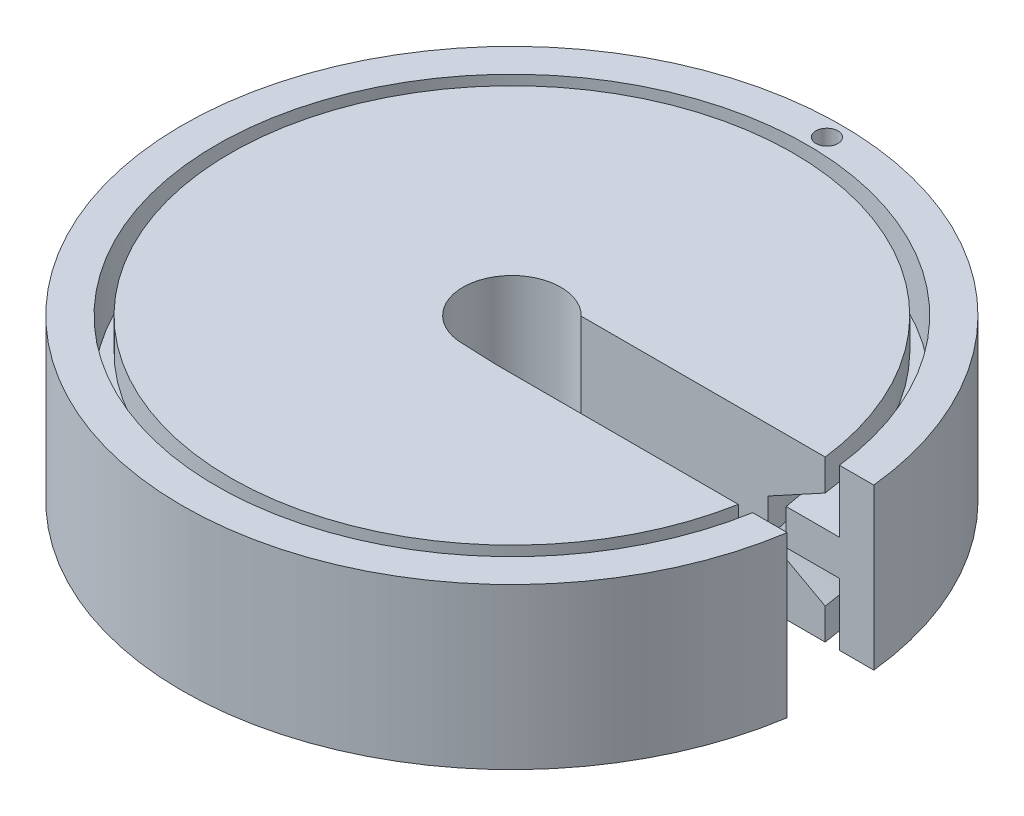
ISO-10303-21;
HEADER;
FILE_DESCRIPTION(('STEP AP214'),'2;1');
FILE_NAME('part.step','',(''),(''),'','','');
FILE_SCHEMA(('AUTOMOTIVE_DESIGN { 1 0 10303 214 1 1 1 1 }'));
ENDSEC;
DATA;
#1=APPLICATION_CONTEXT('core data for automotive mechanical design processes');
#2=APPLICATION_PROTOCOL_DEFINITION('international standard','automotive_design',2000,#1);
#3=PRODUCT_CONTEXT('',#1,'mechanical');
#4=PRODUCT('Part','Part','',(#3));
#5=PRODUCT_RELATED_PRODUCT_CATEGORY('part','',(#4));
#6=PRODUCT_DEFINITION_FORMATION('','',#4);
#7=PRODUCT_DEFINITION_CONTEXT('part definition',#1,'design');
#8=PRODUCT_DEFINITION('design','',#6,#7);
#9=PRODUCT_DEFINITION_SHAPE('','',#8);
#10=(LENGTH_UNIT() NAMED_UNIT(*) SI_UNIT(.MILLI.,.METRE.));
#11=(NAMED_UNIT(*) PLANE_ANGLE_UNIT() SI_UNIT($,.RADIAN.));
#12=(NAMED_UNIT(*) SI_UNIT($,.STERADIAN.) SOLID_ANGLE_UNIT());
#13=UNCERTAINTY_MEASURE_WITH_UNIT(LENGTH_MEASURE(1.E-05),#10,'distance_accuracy_value','');
#14=(GEOMETRIC_REPRESENTATION_CONTEXT(3) GLOBAL_UNCERTAINTY_ASSIGNED_CONTEXT((#13)) GLOBAL_UNIT_ASSIGNED_CONTEXT((#10,
#11,#12)) REPRESENTATION_CONTEXT('',''));
#15=CARTESIAN_POINT('',(0.,0.,0.));
#16=DIRECTION('',(0.,0.,1.));
#17=DIRECTION('',(1.,0.,0.));
#18=AXIS2_PLACEMENT_3D('',#15,#16,#17);
#19=CARTESIAN_POINT('',(0.,0.,0.));
#20=DIRECTION('',(0.,1.,0.));
#21=DIRECTION('',(0.,0.,1.));
#22=AXIS2_PLACEMENT_3D('',#19,#20,#21);
#23=CYLINDRICAL_SURFACE('',#22,6.635);
#24=CARTESIAN_POINT('',(0.,0.,0.));
#25=DIRECTION('',(0.,1.,0.));
#26=DIRECTION('',(0.,0.,1.));
#27=AXIS2_PLACEMENT_3D('',#24,#25,#26);
#28=CIRCLE('',#27,6.635);
#29=CARTESIAN_POINT('',(6.59076876108202,0.,-0.764847787435785));
#30=VERTEX_POINT('',#29);
#31=CARTESIAN_POINT('',(6.53779356702054,0.,1.13158308357133));
#32=VERTEX_POINT('',#31);
#33=EDGE_CURVE('E151',#30,#32,#28,.T.);
#34=ORIENTED_EDGE('',*,*,#33,.F.);
#35=DIRECTION('',(0.,1.,0.));
#36=VECTOR('',#35,1.);
#37=CARTESIAN_POINT('',(6.59076876108202,0.,-0.764847787435785));
#38=LINE('',#37,#36);
#39=CARTESIAN_POINT('',(6.59076876108202,1.4,-0.764847787435785));
#40=VERTEX_POINT('',#39);
#41=EDGE_CURVE('E177',#30,#40,#38,.T.);
#42=ORIENTED_EDGE('',*,*,#41,.T.);
#43=CARTESIAN_POINT('',(0.,1.4,0.));
#44=DIRECTION('',(0.,1.,0.));
#45=DIRECTION('',(0.,0.,1.));
#46=AXIS2_PLACEMENT_3D('',#43,#44,#45);
#47=CIRCLE('',#46,6.635);
#48=CARTESIAN_POINT('',(6.53779356702054,1.4,1.13158308357133));
#49=VERTEX_POINT('',#48);
#50=EDGE_CURVE('E163',#49,#40,#47,.F.);
#51=ORIENTED_EDGE('',*,*,#50,.F.);
#52=DIRECTION('',(0.,1.,0.));
#53=VECTOR('',#52,1.);
#54=CARTESIAN_POINT('',(6.53779356702054,0.,1.13158308357133));
#55=LINE('',#54,#53);
#56=EDGE_CURVE('E135',#49,#32,#55,.F.);
#57=ORIENTED_EDGE('',*,*,#56,.T.);
#58=EDGE_LOOP('',(#34,#42,#51,#57));
#59=FACE_BOUND('',#58,.T.);
#60=ADVANCED_FACE('F61',(#59),#23,.F.);
#61=CARTESIAN_POINT('',(0.,3.6,0.));
#62=DIRECTION('',(0.,1.,0.));
#63=DIRECTION('',(0.,0.,1.));
#64=AXIS2_PLACEMENT_3D('',#61,#62,#63);
#65=PLANE('',#64);
#66=CARTESIAN_POINT('',(0.0701378967160222,3.6,-7.00412409738008));
#67=DIRECTION('',(0.,1.,0.));
#68=DIRECTION('',(0.,0.,1.));
#69=AXIS2_PLACEMENT_3D('',#66,#67,#68);
#70=CIRCLE('',#69,0.247262234227057);
#71=CARTESIAN_POINT('',(0.0701378967160222,3.6,-6.75686186315302));
#72=VERTEX_POINT('',#71);
#73=EDGE_CURVE('E146',#72,#72,#70,.T.);
#74=ORIENTED_EDGE('',*,*,#73,.F.);
#75=EDGE_LOOP('',(#74));
#76=FACE_BOUND('',#75,.T.);
#77=DIRECTION('',(-1.,0.,0.));
#78=VECTOR('',#77,1.);
#79=CARTESIAN_POINT('',(0.748503344471411,3.6,-0.764847787435785));
#80=LINE('',#79,#78);
#81=CARTESIAN_POINT('',(7.36187744560648,3.6,-0.764847787435785));
#82=VERTEX_POINT('',#81);
#83=CARTESIAN_POINT('',(6.59076876108202,3.6,-0.764847787435785));
#84=VERTEX_POINT('',#83);
#85=EDGE_CURVE('E145',#82,#84,#80,.T.);
#86=ORIENTED_EDGE('',*,*,#85,.F.);
#87=CARTESIAN_POINT('',(0.,3.6,0.));
#88=DIRECTION('',(0.,1.,0.));
#89=DIRECTION('',(0.,0.,1.));
#90=AXIS2_PLACEMENT_3D('',#87,#88,#89);
#91=CIRCLE('',#90,7.40150198689934);
#92=CARTESIAN_POINT('',(7.31448914053812,3.6,1.13158308357133));
#93=VERTEX_POINT('',#92);
#94=EDGE_CURVE('E144',#82,#93,#91,.T.);
#95=ORIENTED_EDGE('',*,*,#94,.T.);
#96=DIRECTION('',(1.,0.,0.));
#97=VECTOR('',#96,1.);
#98=CARTESIAN_POINT('',(8.00599840851785,3.6,1.13158308357133));
#99=LINE('',#98,#97);
#100=CARTESIAN_POINT('',(6.53779356702054,3.6,1.13158308357133));
#101=VERTEX_POINT('',#100);
#102=EDGE_CURVE('E127',#101,#93,#99,.T.);
#103=ORIENTED_EDGE('',*,*,#102,.F.);
#104=CARTESIAN_POINT('',(0.,3.6,0.));
#105=DIRECTION('',(0.,1.,0.));
#106=DIRECTION('',(0.,0.,1.));
#107=AXIS2_PLACEMENT_3D('',#104,#105,#106);
#108=CIRCLE('',#107,6.635);
#109=EDGE_CURVE('E142',#84,#101,#108,.T.);
#110=ORIENTED_EDGE('',*,*,#109,.F.);
#111=EDGE_LOOP('',(#86,#95,#103,#110));
#112=FACE_BOUND('',#111,.T.);
#113=ADVANCED_FACE('F141',(#76,#112),#65,.T.);
#114=CARTESIAN_POINT('',(0.,2.2,0.));
#115=DIRECTION('',(0.,1.,0.));
#116=DIRECTION('',(0.,0.,1.));
#117=AXIS2_PLACEMENT_3D('',#114,#115,#116);
#118=CIRCLE('',#117,6.635);
#119=CARTESIAN_POINT('',(6.53779356702054,2.2,1.13158308357133));
#120=VERTEX_POINT('',#119);
#121=CARTESIAN_POINT('',(6.59076876108202,2.2,-0.764847787435785));
#122=VERTEX_POINT('',#121);
#123=EDGE_CURVE('E152',#120,#122,#118,.F.);
#124=ORIENTED_EDGE('',*,*,#123,.T.);
#125=DIRECTION('',(0.,1.,0.));
#126=VECTOR('',#125,1.);
#127=CARTESIAN_POINT('',(6.59076876108202,0.,-0.764847787435785));
#128=LINE('',#127,#126);
#129=EDGE_CURVE('E150',#122,#84,#128,.T.);
#130=ORIENTED_EDGE('',*,*,#129,.T.);
#131=ORIENTED_EDGE('',*,*,#109,.T.);
#132=DIRECTION('',(0.,1.,0.));
#133=VECTOR('',#132,1.);
#134=CARTESIAN_POINT('',(6.53779356702054,0.,1.13158308357133));
#135=LINE('',#134,#133);
#136=EDGE_CURVE('E124',#101,#120,#135,.F.);
#137=ORIENTED_EDGE('',*,*,#136,.T.);
#138=EDGE_LOOP('',(#124,#130,#131,#137));
#139=FACE_BOUND('',#138,.T.);
#140=ADVANCED_FACE('F149',(#139),#23,.F.);
#141=CARTESIAN_POINT('',(0.,0.7,0.));
#142=DIRECTION('',(0.,-1.,0.));
#143=DIRECTION('',(0.,0.,-1.));
#144=AXIS2_PLACEMENT_3D('',#141,#142,#143);
#145=CYLINDRICAL_SURFACE('',#144,7.40150198689934);
#146=DIRECTION('',(0.,-1.,0.));
#147=VECTOR('',#146,1.);
#148=CARTESIAN_POINT('',(7.36187744560648,0.7,-0.764847787435785));
#149=LINE('',#148,#147);
#150=CARTESIAN_POINT('',(7.36187744560648,0.,-0.764847787435785));
#151=VERTEX_POINT('',#150);
#152=EDGE_CURVE('E173',#151,#82,#149,.F.);
#153=ORIENTED_EDGE('',*,*,#152,.F.);
#154=CARTESIAN_POINT('',(0.,0.,0.));
#155=DIRECTION('',(0.,-1.,0.));
#156=DIRECTION('',(0.,0.,-1.));
#157=AXIS2_PLACEMENT_3D('',#154,#155,#156);
#158=CIRCLE('',#157,7.40150198689934);
#159=CARTESIAN_POINT('',(7.31448914053812,0.,1.13158308357133));
#160=VERTEX_POINT('',#159);
#161=EDGE_CURVE('E160',#160,#151,#158,.T.);
#162=ORIENTED_EDGE('',*,*,#161,.F.);
#163=DIRECTION('',(0.,-1.,0.));
#164=VECTOR('',#163,1.);
#165=CARTESIAN_POINT('',(7.31448914053812,0.7,1.13158308357133));
#166=LINE('',#165,#164);
#167=EDGE_CURVE('E184',#93,#160,#166,.T.);
#168=ORIENTED_EDGE('',*,*,#167,.F.);
#169=ORIENTED_EDGE('',*,*,#94,.F.);
#170=EDGE_LOOP('',(#153,#162,#168,#169));
#171=FACE_BOUND('',#170,.T.);
#172=ADVANCED_FACE('F63',(#171),#145,.T.);
#173=CARTESIAN_POINT('',(0.,0.,0.));
#174=DIRECTION('',(0.,-1.,0.));
#175=DIRECTION('',(0.,0.,-1.));
#176=AXIS2_PLACEMENT_3D('',#173,#174,#175);
#177=PLANE('',#176);
#178=CARTESIAN_POINT('',(0.0701378967160222,0.,-7.00412409738008));
#179=DIRECTION('',(0.,-1.,0.));
#180=DIRECTION('',(0.,0.,-1.));
#181=AXIS2_PLACEMENT_3D('',#178,#179,#180);
#182=CIRCLE('',#181,0.247262234227057);
#183=CARTESIAN_POINT('',(0.0701378967160222,0.,-7.25138633160714));
#184=VERTEX_POINT('',#183);
#185=EDGE_CURVE('E65',#184,#184,#182,.T.);
#186=ORIENTED_EDGE('',*,*,#185,.F.);
#187=EDGE_LOOP('',(#186));
#188=FACE_BOUND('',#187,.T.);
#189=DIRECTION('',(-1.,0.,0.));
#190=VECTOR('',#189,1.);
#191=CARTESIAN_POINT('',(0.748503344471411,0.,-0.764847787435785));
#192=LINE('',#191,#190);
#193=EDGE_CURVE('E190',#151,#30,#192,.T.);
#194=ORIENTED_EDGE('',*,*,#193,.T.);
#195=ORIENTED_EDGE('',*,*,#33,.T.);
#196=DIRECTION('',(1.,0.,0.));
#197=VECTOR('',#196,1.);
#198=CARTESIAN_POINT('',(8.00599840851785,0.,1.13158308357133));
#199=LINE('',#198,#197);
#200=EDGE_CURVE('E191',#32,#160,#199,.T.);
#201=ORIENTED_EDGE('',*,*,#200,.T.);
#202=ORIENTED_EDGE('',*,*,#161,.T.);
#203=EDGE_LOOP('',(#194,#195,#201,#202));
#204=FACE_BOUND('',#203,.T.);
#205=ADVANCED_FACE('F205',(#188,#204),#177,.T.);
#206=CARTESIAN_POINT('',(0.,2.2,0.));
#207=DIRECTION('',(0.,1.,0.));
#208=DIRECTION('',(0.,0.,1.));
#209=AXIS2_PLACEMENT_3D('',#206,#207,#208);
#210=PLANE('',#209);
#211=DIRECTION('',(-1.,0.,0.));
#212=VECTOR('',#211,1.);
#213=CARTESIAN_POINT('',(0.,2.2,-0.764847787435785));
#214=LINE('',#213,#212);
#215=CARTESIAN_POINT('',(5.39606410840852,2.2,-0.764847787435785));
#216=VERTEX_POINT('',#215);
#217=EDGE_CURVE('E84',#122,#216,#214,.T.);
#218=ORIENTED_EDGE('',*,*,#217,.F.);
#219=ORIENTED_EDGE('',*,*,#123,.F.);
#220=DIRECTION('',(1.,0.,0.));
#221=VECTOR('',#220,1.);
#222=CARTESIAN_POINT('',(0.,2.2,1.13158308357133));
#223=LINE('',#222,#221);
#224=CARTESIAN_POINT('',(5.33123060136918,2.2,1.13158308357133));
#225=VERTEX_POINT('',#224);
#226=EDGE_CURVE('E130',#225,#120,#223,.T.);
#227=ORIENTED_EDGE('',*,*,#226,.F.);
#228=CARTESIAN_POINT('',(0.,2.2,0.));
#229=DIRECTION('',(0.,1.,0.));
#230=DIRECTION('',(0.,0.,1.));
#231=AXIS2_PLACEMENT_3D('',#228,#229,#230);
#232=CIRCLE('',#231,5.45);
#233=EDGE_CURVE('E156',#216,#225,#232,.T.);
#234=ORIENTED_EDGE('',*,*,#233,.F.);
#235=EDGE_LOOP('',(#218,#219,#227,#234));
#236=FACE_BOUND('',#235,.T.);
#237=ADVANCED_FACE('F208',(#236),#210,.T.);
#238=CARTESIAN_POINT('',(0.,1.4,0.));
#239=DIRECTION('',(0.,1.,0.));
#240=DIRECTION('',(0.,0.,1.));
#241=AXIS2_PLACEMENT_3D('',#238,#239,#240);
#242=PLANE('',#241);
#243=ORIENTED_EDGE('',*,*,#50,.T.);
#244=DIRECTION('',(-1.,0.,0.));
#245=VECTOR('',#244,1.);
#246=CARTESIAN_POINT('',(0.,1.4,-0.764847787435785));
#247=LINE('',#246,#245);
#248=CARTESIAN_POINT('',(5.39606410840852,1.4,-0.764847787435785));
#249=VERTEX_POINT('',#248);
#250=EDGE_CURVE('E182',#40,#249,#247,.T.);
#251=ORIENTED_EDGE('',*,*,#250,.T.);
#252=CARTESIAN_POINT('',(0.,1.4,0.));
#253=DIRECTION('',(0.,1.,0.));
#254=DIRECTION('',(0.,0.,1.));
#255=AXIS2_PLACEMENT_3D('',#252,#253,#254);
#256=CIRCLE('',#255,5.45);
#257=CARTESIAN_POINT('',(5.33123060136918,1.4,1.13158308357133));
#258=VERTEX_POINT('',#257);
#259=EDGE_CURVE('E170',#249,#258,#256,.T.);
#260=ORIENTED_EDGE('',*,*,#259,.T.);
#261=DIRECTION('',(1.,0.,0.));
#262=VECTOR('',#261,1.);
#263=CARTESIAN_POINT('',(0.,1.4,1.13158308357133));
#264=LINE('',#263,#262);
#265=EDGE_CURVE('E77',#258,#49,#264,.T.);
#266=ORIENTED_EDGE('',*,*,#265,.T.);
#267=EDGE_LOOP('',(#243,#251,#260,#266));
#268=FACE_BOUND('',#267,.T.);
#269=ADVANCED_FACE('F213',(#268),#242,.F.);
#270=CARTESIAN_POINT('',(0.,2.2,0.));
#271=DIRECTION('',(0.,-1.,0.));
#272=DIRECTION('',(0.,0.,-1.));
#273=AXIS2_PLACEMENT_3D('',#270,#271,#272);
#274=CYLINDRICAL_SURFACE('',#273,5.45);
#275=DIRECTION('',(0.,-1.,0.));
#276=VECTOR('',#275,1.);
#277=CARTESIAN_POINT('',(5.39606410840852,2.2,-0.764847787435785));
#278=LINE('',#277,#276);
#279=EDGE_CURVE('E13',#216,#249,#278,.T.);
#280=ORIENTED_EDGE('',*,*,#279,.F.);
#281=ORIENTED_EDGE('',*,*,#233,.T.);
#282=DIRECTION('',(0.,-1.,0.));
#283=VECTOR('',#282,1.);
#284=CARTESIAN_POINT('',(5.33123060136918,2.2,1.13158308357133));
#285=LINE('',#284,#283);
#286=EDGE_CURVE('E70',#258,#225,#285,.F.);
#287=ORIENTED_EDGE('',*,*,#286,.F.);
#288=ORIENTED_EDGE('',*,*,#259,.F.);
#289=EDGE_LOOP('',(#280,#281,#287,#288));
#290=FACE_BOUND('',#289,.T.);
#291=ADVANCED_FACE('F216',(#290),#274,.F.);
#292=CARTESIAN_POINT('',(8.00599840851785,0.,1.13158308357133));
#293=DIRECTION('',(0.,0.,1.));
#294=DIRECTION('',(1.,0.,0.));
#295=AXIS2_PLACEMENT_3D('',#292,#293,#294);
#296=PLANE('',#295);
#297=ORIENTED_EDGE('',*,*,#167,.T.);
#298=ORIENTED_EDGE('',*,*,#200,.F.);
#299=ORIENTED_EDGE('',*,*,#56,.F.);
#300=ORIENTED_EDGE('',*,*,#265,.F.);
#301=ORIENTED_EDGE('',*,*,#286,.T.);
#302=ORIENTED_EDGE('',*,*,#226,.T.);
#303=ORIENTED_EDGE('',*,*,#136,.F.);
#304=ORIENTED_EDGE('',*,*,#102,.T.);
#305=EDGE_LOOP('',(#297,#298,#299,#300,#301,#302,#303,#304));
#306=FACE_BOUND('',#305,.T.);
#307=ADVANCED_FACE('F126',(#306),#296,.F.);
#308=CARTESIAN_POINT('',(0.748503344471411,0.,-0.764847787435785));
#309=DIRECTION('',(0.,0.,-1.));
#310=DIRECTION('',(-1.,0.,0.));
#311=AXIS2_PLACEMENT_3D('',#308,#309,#310);
#312=PLANE('',#311);
#313=ORIENTED_EDGE('',*,*,#152,.T.);
#314=ORIENTED_EDGE('',*,*,#85,.T.);
#315=ORIENTED_EDGE('',*,*,#129,.F.);
#316=ORIENTED_EDGE('',*,*,#217,.T.);
#317=ORIENTED_EDGE('',*,*,#279,.T.);
#318=ORIENTED_EDGE('',*,*,#250,.F.);
#319=ORIENTED_EDGE('',*,*,#41,.F.);
#320=ORIENTED_EDGE('',*,*,#193,.F.);
#321=EDGE_LOOP('',(#313,#314,#315,#316,#317,#318,#319,#320));
#322=FACE_BOUND('',#321,.T.);
#323=ADVANCED_FACE('F240',(#322),#312,.F.);
#324=CARTESIAN_POINT('',(0.0701378967160222,-1.4,-7.00412409738008));
#325=DIRECTION('',(0.,1.,0.));
#326=DIRECTION('',(0.,0.,1.));
#327=AXIS2_PLACEMENT_3D('',#324,#325,#326);
#328=CYLINDRICAL_SURFACE('',#327,0.247262234227057);
#329=ORIENTED_EDGE('',*,*,#73,.T.);
#330=EDGE_LOOP('',(#329));
#331=FACE_BOUND('',#330,.T.);
#332=ORIENTED_EDGE('',*,*,#185,.T.);
#333=EDGE_LOOP('',(#332));
#334=FACE_BOUND('',#333,.T.);
#335=ADVANCED_FACE('F203',(#331,#334),#328,.F.);
#336=CLOSED_SHELL('',(#60,#113,#140,#172,#205,#237,#269,#291,#307,#323,#335));
#337=MANIFOLD_SOLID_BREP('B2',#336);
#338=CARTESIAN_POINT('',(0.,0.7,0.));
#339=DIRECTION('',(0.,1.,0.));
#340=DIRECTION('',(0.,0.,1.));
#341=AXIS2_PLACEMENT_3D('',#338,#339,#340);
#342=PLANE('',#341);
#343=DIRECTION('',(-0.999110978780776,0.,-0.0421574676625482));
#344=VECTOR('',#343,1.);
#345=CARTESIAN_POINT('',(-0.0463319876571722,0.7,1.09804502271231));
#346=LINE('',#345,#344);
#347=CARTESIAN_POINT('',(0.748503344471411,0.7,1.13158308357133));
#348=VERTEX_POINT('',#347);
#349=CARTESIAN_POINT('',(0.,0.7,1.1));
#350=VERTEX_POINT('',#349);
#351=EDGE_CURVE('E452',#348,#350,#346,.T.);
#352=ORIENTED_EDGE('',*,*,#351,.F.);
#353=DIRECTION('',(1.,0.,0.));
#354=VECTOR('',#353,1.);
#355=CARTESIAN_POINT('',(0.,0.7,1.13158308357133));
#356=LINE('',#355,#354);
#357=CARTESIAN_POINT('',(1.94474155737342,0.7,1.13158308357133));
#358=VERTEX_POINT('',#357);
#359=EDGE_CURVE('E463',#348,#358,#356,.T.);
#360=ORIENTED_EDGE('',*,*,#359,.T.);
#361=CARTESIAN_POINT('',(0.,0.7,0.));
#362=DIRECTION('',(0.,1.,0.));
#363=DIRECTION('',(0.,0.,1.));
#364=AXIS2_PLACEMENT_3D('',#361,#362,#363);
#365=CIRCLE('',#364,2.25);
#366=CARTESIAN_POINT('',(2.11601225470331,0.7,-0.764847787435785));
#367=VERTEX_POINT('',#366);
#368=EDGE_CURVE('E629',#367,#358,#365,.T.);
#369=ORIENTED_EDGE('',*,*,#368,.F.);
#370=DIRECTION('',(-1.,0.,0.));
#371=VECTOR('',#370,1.);
#372=CARTESIAN_POINT('',(0.,0.7,-0.764847787435785));
#373=LINE('',#372,#371);
#374=CARTESIAN_POINT('',(0.790574387426373,0.7,-0.764847787435785));
#375=VERTEX_POINT('',#374);
#376=EDGE_CURVE('E457',#367,#375,#373,.T.);
#377=ORIENTED_EDGE('',*,*,#376,.T.);
#378=CARTESIAN_POINT('',(0.,0.7,0.));
#379=DIRECTION('',(0.,-1.,0.));
#380=DIRECTION('',(0.,0.,-1.));
#381=AXIS2_PLACEMENT_3D('',#378,#379,#380);
#382=CIRCLE('',#381,1.1);
#383=EDGE_CURVE('E466',#350,#375,#382,.T.);
#384=ORIENTED_EDGE('',*,*,#383,.F.);
#385=EDGE_LOOP('',(#352,#360,#369,#377,#384));
#386=FACE_BOUND('',#385,.T.);
#387=ADVANCED_FACE('F359',(#386),#342,.F.);
#388=CARTESIAN_POINT('',(0.,3.6,0.));
#389=DIRECTION('',(0.,1.,0.));
#390=DIRECTION('',(0.,0.,1.));
#391=AXIS2_PLACEMENT_3D('',#388,#389,#390);
#392=PLANE('',#391);
#393=DIRECTION('',(1.,0.,0.));
#394=VECTOR('',#393,1.);
#395=CARTESIAN_POINT('',(8.00599840851785,3.6,1.13158308357133));
#396=LINE('',#395,#394);
#397=CARTESIAN_POINT('',(0.748503344471411,3.6,1.13158308357133));
#398=VERTEX_POINT('',#397);
#399=CARTESIAN_POINT('',(6.21602471860115,3.6,1.13158308357133));
#400=VERTEX_POINT('',#399);
#401=EDGE_CURVE('E468',#398,#400,#396,.T.);
#402=ORIENTED_EDGE('',*,*,#401,.F.);
#403=DIRECTION('',(-0.999110978780776,0.,-0.0421574676625482));
#404=VECTOR('',#403,1.);
#405=CARTESIAN_POINT('',(-0.0463319876571722,3.6,1.09804502271231));
#406=LINE('',#405,#404);
#407=CARTESIAN_POINT('',(0.,3.6,1.1));
#408=VERTEX_POINT('',#407);
#409=EDGE_CURVE('E454',#398,#408,#406,.T.);
#410=ORIENTED_EDGE('',*,*,#409,.T.);
#411=CARTESIAN_POINT('',(0.,3.6,0.));
#412=DIRECTION('',(0.,-1.,0.));
#413=DIRECTION('',(0.,0.,-1.));
#414=AXIS2_PLACEMENT_3D('',#411,#412,#413);
#415=CIRCLE('',#414,1.1);
#416=CARTESIAN_POINT('',(0.790574387426373,3.6,-0.764847787435785));
#417=VERTEX_POINT('',#416);
#418=EDGE_CURVE('E379',#408,#417,#415,.T.);
#419=ORIENTED_EDGE('',*,*,#418,.T.);
#420=DIRECTION('',(-1.,0.,0.));
#421=VECTOR('',#420,1.);
#422=CARTESIAN_POINT('',(0.748503344471411,3.6,-0.764847787435785));
#423=LINE('',#422,#421);
#424=CARTESIAN_POINT('',(6.27171838010444,3.6,-0.764847787435785));
#425=VERTEX_POINT('',#424);
#426=EDGE_CURVE('E644',#425,#417,#423,.T.);
#427=ORIENTED_EDGE('',*,*,#426,.F.);
#428=CARTESIAN_POINT('',(0.,3.6,0.));
#429=DIRECTION('',(0.,1.,0.));
#430=DIRECTION('',(0.,0.,1.));
#431=AXIS2_PLACEMENT_3D('',#428,#429,#430);
#432=CIRCLE('',#431,6.3181835662859);
#433=EDGE_CURVE('E485',#425,#400,#432,.T.);
#434=ORIENTED_EDGE('',*,*,#433,.T.);
#435=EDGE_LOOP('',(#402,#410,#419,#427,#434));
#436=FACE_BOUND('',#435,.T.);
#437=ADVANCED_FACE('F694',(#436),#392,.T.);
#438=CARTESIAN_POINT('',(0.,3.6,0.));
#439=DIRECTION('',(0.,-1.,0.));
#440=DIRECTION('',(0.,0.,-1.));
#441=AXIS2_PLACEMENT_3D('',#438,#439,#440);
#442=CYLINDRICAL_SURFACE('',#441,1.1);
#443=DIRECTION('',(0.,-1.,0.));
#444=VECTOR('',#443,1.);
#445=CARTESIAN_POINT('',(0.,6.4,1.1));
#446=LINE('',#445,#444);
#447=EDGE_CURVE('E698',#408,#350,#446,.T.);
#448=ORIENTED_EDGE('',*,*,#447,.T.);
#449=ORIENTED_EDGE('',*,*,#383,.T.);
#450=DIRECTION('',(0.,-1.,0.));
#451=VECTOR('',#450,1.);
#452=CARTESIAN_POINT('',(0.790574387426373,3.6,-0.764847787435785));
#453=LINE('',#452,#451);
#454=EDGE_CURVE('E59',#375,#417,#453,.F.);
#455=ORIENTED_EDGE('',*,*,#454,.T.);
#456=ORIENTED_EDGE('',*,*,#418,.F.);
#457=EDGE_LOOP('',(#448,#449,#455,#456));
#458=FACE_BOUND('',#457,.T.);
#459=ADVANCED_FACE('F697',(#458),#442,.F.);
#460=CARTESIAN_POINT('',(0.,0.,0.));
#461=DIRECTION('',(0.,1.,0.));
#462=DIRECTION('',(0.,0.,1.));
#463=AXIS2_PLACEMENT_3D('',#460,#461,#462);
#464=PLANE('',#463);
#465=CARTESIAN_POINT('',(0.,0.,0.));
#466=DIRECTION('',(0.,1.,0.));
#467=DIRECTION('',(0.,0.,1.));
#468=AXIS2_PLACEMENT_3D('',#465,#466,#467);
#469=CIRCLE('',#468,6.3181835662859);
#470=CARTESIAN_POINT('',(6.27171838010444,0.,-0.764847787435785));
#471=VERTEX_POINT('',#470);
#472=CARTESIAN_POINT('',(6.21602471860115,0.,1.13158308357133));
#473=VERTEX_POINT('',#472);
#474=EDGE_CURVE('E593',#471,#473,#469,.T.);
#475=ORIENTED_EDGE('',*,*,#474,.F.);
#476=DIRECTION('',(-1.,0.,0.));
#477=VECTOR('',#476,1.);
#478=CARTESIAN_POINT('',(0.748503344471411,0.,-0.764847787435785));
#479=LINE('',#478,#477);
#480=CARTESIAN_POINT('',(2.11601225470331,0.,-0.764847787435785));
#481=VERTEX_POINT('',#480);
#482=EDGE_CURVE('E458',#471,#481,#479,.T.);
#483=ORIENTED_EDGE('',*,*,#482,.T.);
#484=CARTESIAN_POINT('',(0.,0.,0.));
#485=DIRECTION('',(0.,1.,0.));
#486=DIRECTION('',(0.,0.,1.));
#487=AXIS2_PLACEMENT_3D('',#484,#485,#486);
#488=CIRCLE('',#487,2.25);
#489=CARTESIAN_POINT('',(1.94474155737342,0.,1.13158308357133));
#490=VERTEX_POINT('',#489);
#491=EDGE_CURVE('E631',#481,#490,#488,.T.);
#492=ORIENTED_EDGE('',*,*,#491,.T.);
#493=DIRECTION('',(1.,0.,0.));
#494=VECTOR('',#493,1.);
#495=CARTESIAN_POINT('',(8.00599840851785,0.,1.13158308357133));
#496=LINE('',#495,#494);
#497=EDGE_CURVE('E642',#490,#473,#496,.T.);
#498=ORIENTED_EDGE('',*,*,#497,.T.);
#499=EDGE_LOOP('',(#475,#483,#492,#498));
#500=FACE_BOUND('',#499,.T.);
#501=ADVANCED_FACE('F640',(#500),#464,.F.);
#502=CARTESIAN_POINT('',(0.,0.7,0.));
#503=DIRECTION('',(0.,-1.,0.));
#504=DIRECTION('',(0.,0.,-1.));
#505=AXIS2_PLACEMENT_3D('',#502,#503,#504);
#506=CYLINDRICAL_SURFACE('',#505,6.3181835662859);
#507=CARTESIAN_POINT('',(0.,0.7,0.));
#508=DIRECTION('',(0.,1.,0.));
#509=DIRECTION('',(0.992645799905307,0.,-0.121055012000134));
#510=AXIS2_PLACEMENT_3D('',#507,#508,#509);
#511=CIRCLE('',#510,6.3181835662859);
#512=CARTESIAN_POINT('',(6.27171838010444,0.7,-0.764847787435785));
#513=VERTEX_POINT('',#512);
#514=CARTESIAN_POINT('',(6.21602471860115,0.699999999999999,1.13158308357133));
#515=VERTEX_POINT('',#514);
#516=EDGE_CURVE('E371',#513,#515,#511,.T.);
#517=ORIENTED_EDGE('',*,*,#516,.F.);
#518=DIRECTION('',(0.,-1.,0.));
#519=VECTOR('',#518,1.);
#520=CARTESIAN_POINT('',(6.27171838010444,0.7,-0.764847787435785));
#521=LINE('',#520,#519);
#522=EDGE_CURVE('E551',#513,#471,#521,.T.);
#523=ORIENTED_EDGE('',*,*,#522,.T.);
#524=ORIENTED_EDGE('',*,*,#474,.T.);
#525=DIRECTION('',(0.,-1.,0.));
#526=VECTOR('',#525,1.);
#527=CARTESIAN_POINT('',(6.21602471860115,0.7,1.13158308357133));
#528=LINE('',#527,#526);
#529=EDGE_CURVE('E472',#473,#515,#528,.F.);
#530=ORIENTED_EDGE('',*,*,#529,.T.);
#531=EDGE_LOOP('',(#517,#523,#524,#530));
#532=FACE_BOUND('',#531,.T.);
#533=ADVANCED_FACE('F361',(#532),#506,.T.);
#534=CARTESIAN_POINT('',(0.,0.7,0.));
#535=DIRECTION('',(0.,-1.,0.));
#536=DIRECTION('',(0.,0.,-1.));
#537=AXIS2_PLACEMENT_3D('',#534,#535,#536);
#538=CYLINDRICAL_SURFACE('',#537,2.25);
#539=DIRECTION('',(0.,-1.,0.));
#540=VECTOR('',#539,1.);
#541=CARTESIAN_POINT('',(2.11601225470331,0.7,-0.764847787435785));
#542=LINE('',#541,#540);
#543=EDGE_CURVE('E656',#367,#481,#542,.T.);
#544=ORIENTED_EDGE('',*,*,#543,.F.);
#545=ORIENTED_EDGE('',*,*,#368,.T.);
#546=DIRECTION('',(0.,-1.,0.));
#547=VECTOR('',#546,1.);
#548=CARTESIAN_POINT('',(1.94474155737342,0.7,1.13158308357133));
#549=LINE('',#548,#547);
#550=EDGE_CURVE('E387',#490,#358,#549,.F.);
#551=ORIENTED_EDGE('',*,*,#550,.F.);
#552=ORIENTED_EDGE('',*,*,#491,.F.);
#553=EDGE_LOOP('',(#544,#545,#551,#552));
#554=FACE_BOUND('',#553,.T.);
#555=ADVANCED_FACE('F557',(#554),#538,.F.);
#556=CARTESIAN_POINT('',(0.,1.4,0.));
#557=DIRECTION('',(0.,-1.,0.));
#558=DIRECTION('',(0.,0.,-1.));
#559=AXIS2_PLACEMENT_3D('',#556,#557,#558);
#560=CONICAL_SURFACE('',#559,5.04602106114193,1.06776567367823);
#561=CARTESIAN_POINT('',(6.27318304909186,0.6992,-0.764847787435785));
#562=CARTESIAN_POINT('',(6.10194462792508,0.792730046763998,-0.764847787435785));
#563=CARTESIAN_POINT('',(5.93068321571265,0.886217930588165,-0.764847787435785));
#564=CARTESIAN_POINT('',(5.58809854478493,1.07308183577845,-0.764847787435785));
#565=CARTESIAN_POINT('',(5.41677528583977,1.16645785672313,-0.764847787435785));
#566=CARTESIAN_POINT('',(4.90258114105112,1.44643551464793,-0.764847787435785));
#567=CARTESIAN_POINT('',(4.55959551995316,1.63282681918069,-0.764847787435785));
#568=CARTESIAN_POINT('',(4.03545103032134,1.9165974410599,-0.764847787435785));
#569=CARTESIAN_POINT('',(3.85450381967019,2.01436761431843,-0.764847787435785));
#570=CARTESIAN_POINT('',(3.49236182605456,2.20945329570904,-0.764847787435785));
#571=CARTESIAN_POINT('',(3.31116704069006,2.30676879939253,-0.764847787435785));
#572=CARTESIAN_POINT('',(2.94843729121458,2.5006527417355,-0.764847787435785));
#573=CARTESIAN_POINT('',(2.76690242503845,2.59722136361195,-0.764847787435785));
#574=CARTESIAN_POINT('',(2.40319292577666,2.78914378973657,-0.764847787435785));
#575=CARTESIAN_POINT('',(2.2210183071163,2.88449762115462,-0.764847787435785));
#576=CARTESIAN_POINT('',(1.92108422667564,3.0390011896901,-0.764847787435785));
#577=CARTESIAN_POINT('',(1.80368764999564,3.09885448731433,-0.764847787435785));
#578=CARTESIAN_POINT('',(1.56801829552131,3.21696397013068,-0.764847787435785));
#579=CARTESIAN_POINT('',(1.44974514399013,3.27521941759905,-0.764847787435785));
#580=CARTESIAN_POINT('',(1.27226478614865,3.35987638555575,-0.764847787435785));
#581=CARTESIAN_POINT('',(1.21360112642082,3.38741398547857,-0.764847787435785));
#582=CARTESIAN_POINT('',(1.09580146122888,3.44145638603418,-0.764847787435785));
#583=CARTESIAN_POINT('',(1.03666548384097,3.46796124751398,-0.764847787435785));
#584=CARTESIAN_POINT('',(0.917761523292402,3.51948329528847,-0.764847787435785));
#585=CARTESIAN_POINT('',(0.857993696748313,3.54450084051252,-0.764847787435785));
#586=CARTESIAN_POINT('',(0.737588319828148,3.5923289713083,-0.764847787435785));
#587=CARTESIAN_POINT('',(0.676951050674152,3.61514025279801,-0.764847787435785));
#588=CARTESIAN_POINT('',(0.566294307916249,3.65331822581353,-0.764847787435785));
#589=CARTESIAN_POINT('',(0.516480667386964,3.6692724085495,-0.764847787435785));
#590=CARTESIAN_POINT('',(0.416020318899005,3.69804413818657,-0.764847787435785));
#591=CARTESIAN_POINT('',(0.365375027087771,3.71086652484413,-0.764847787435785));
#592=CARTESIAN_POINT('',(0.262623265666198,3.7323441138769,-0.764847787435785));
#593=CARTESIAN_POINT('',(0.210507167855836,3.74095554589344,-0.764847787435785));
#594=CARTESIAN_POINT('',(0.131739213288414,3.74973005724391,-0.764847787435785));
#595=CARTESIAN_POINT('',(0.105313150118128,3.75196483037257,-0.764847787435785));
#596=CARTESIAN_POINT('',(0.0523602605125661,3.75495690569173,-0.764847787435785));
#597=CARTESIAN_POINT('',(0.0258333780056161,3.75571320736695,-0.764847787435785));
#598=CARTESIAN_POINT('',(-0.000699999999999595,3.75569045247689,-0.764847787435785));
#599=B_SPLINE_CURVE_WITH_KNOTS('',3,(#561,#562,#563,#564,#565,#566,#567,#568,#569,#570,#571,
#572,#573,#574,#575,#576,#577,#578,#579,#580,#581,#582,#583,#584,#585,#586,#587,#588,#589,#590,
#591,#592,#593,#594,#595,#596,#597,#598),.UNSPECIFIED.,.F.,.F.,(4,2,2,2,2,2,2,2,2,2,2,2,2,2,2,2,
2,2,4),(0.,0.585349554369024,1.17070130712646,2.34177964015253,2.95879479874975,
3.57581598179003,4.19268067064226,4.80953153846472,5.20484861201257,5.60034523083944,
5.79475491896574,5.98915313546245,6.1835042464048,6.37779385219986,6.53464048437976,
6.69124317607888,6.8494407765957,6.92896389243332,7.00854080477014),.UNSPECIFIED.);
#600=CARTESIAN_POINT('',(4.98771855777193,1.4,-0.764847787435785));
#601=VERTEX_POINT('',#600);
#602=EDGE_CURVE('E550',#513,#601,#599,.T.);
#603=ORIENTED_EDGE('',*,*,#602,.F.);
#604=ORIENTED_EDGE('',*,*,#516,.T.);
#605=CARTESIAN_POINT('',(-0.0007,3.55389655147222,1.13158308357133));
#606=CARTESIAN_POINT('',(0.0333953670687929,3.55391592619163,1.13158308357133));
#607=CARTESIAN_POINT('',(0.0674848684031919,3.5530712508897,1.13158308357133));
#608=CARTESIAN_POINT('',(0.135568257382823,3.54971993775191,1.13158308357133));
#609=CARTESIAN_POINT('',(0.169562179120679,3.5472139968055,1.13158308357133));
#610=CARTESIAN_POINT('',(0.271020903307704,3.53733121139826,1.13158308357133));
#611=CARTESIAN_POINT('',(0.338262151758239,3.52758836248003,1.13158308357133));
#612=CARTESIAN_POINT('',(0.471103625940935,3.50296629209367,1.13158308357133));
#613=CARTESIAN_POINT('',(0.536713337833794,3.48813624143324,1.13158308357133));
#614=CARTESIAN_POINT('',(0.634374444130266,3.46290327078595,1.13158308357133));
#615=CARTESIAN_POINT('',(0.66682233806377,3.45398787931653,1.13158308357133));
#616=CARTESIAN_POINT('',(0.731466341854671,3.43529147989921,1.13158308357133));
#617=CARTESIAN_POINT('',(0.763662464038066,3.42551051461967,1.13158308357133));
#618=CARTESIAN_POINT('',(0.865002054196916,3.39343781906891,1.13158308357133));
#619=CARTESIAN_POINT('',(0.933715029472058,3.36978578298365,1.13158308357133));
#620=CARTESIAN_POINT('',(1.07023580734791,3.31998522541133,1.13158308357133));
#621=CARTESIAN_POINT('',(1.1380433526394,3.29383601077951,1.13158308357133));
#622=CARTESIAN_POINT('',(1.27298429960174,3.23969980646376,1.13158308357133));
#623=CARTESIAN_POINT('',(1.34011707232189,3.21171125781744,1.13158308357133));
#624=CARTESIAN_POINT('',(1.47380637672489,3.15438607089438,1.13158308357133));
#625=CARTESIAN_POINT('',(1.54036286894378,3.12504934114784,1.13158308357133));
#626=CARTESIAN_POINT('',(1.73966378150471,3.03540182764245,1.13158308357133));
#627=CARTESIAN_POINT('',(1.87172792560884,2.97358277166947,1.13158308357133));
#628=CARTESIAN_POINT('',(2.13464065923332,2.84760934517739,1.13158308357133));
#629=CARTESIAN_POINT('',(2.2654898369412,2.78345618752941,1.13158308357133));
#630=CARTESIAN_POINT('',(2.52888824038047,2.65240379855912,1.13158308357133));
#631=CARTESIAN_POINT('',(2.66142302750436,2.58547559973535,1.13158308357133));
#632=CARTESIAN_POINT('',(2.92596854584208,2.45055359270361,1.13158308357133));
#633=CARTESIAN_POINT('',(3.05797920808814,2.38255964972574,1.13158308357133));
#634=CARTESIAN_POINT('',(3.45306124464573,2.17769157962926,1.13158308357133));
#635=CARTESIAN_POINT('',(3.71557085877042,2.03973529632444,1.13158308357133));
#636=CARTESIAN_POINT('',(4.16667929618726,1.80097066319618,1.13158308357133));
#637=CARTESIAN_POINT('',(4.3554746119864,1.70053153943226,1.13158308357133));
#638=CARTESIAN_POINT('',(4.73284046553497,1.49904422078947,1.13158308357133));
#639=CARTESIAN_POINT('',(4.92141087814949,1.39799579135935,1.13158308357133));
#640=CARTESIAN_POINT('',(5.2946910460896,1.19745847781984,1.13158308357133));
#641=CARTESIAN_POINT('',(5.47940491492899,1.09797724118949,1.13158308357133));
#642=CARTESIAN_POINT('',(5.84859811017542,0.898764004106159,1.13158308357133));
#643=CARTESIAN_POINT('',(6.03307750221752,0.79903212531572,1.13158308357133));
#644=CARTESIAN_POINT('',(6.21750250746503,0.6992,1.13158308357133));
#645=B_SPLINE_CURVE_WITH_KNOTS('',3,(#605,#606,#607,#608,#609,#610,#611,#612,#613,#614,#615,
#616,#617,#618,#619,#620,#621,#622,#623,#624,#625,#626,#627,#628,#629,#630,#631,#632,#633,#634,
#635,#636,#637,#638,#639,#640,#641,#642,#643,#644),.UNSPECIFIED.,.F.,.F.,(4,2,2,2,2,2,2,2,2,2,2,
2,2,2,2,2,2,2,2,4),(0.,0.102264294649653,0.204485717258902,0.408033925349904,0.609667707840149,
0.710609120810969,0.81154556065631,1.02947812053591,1.24747134901403,1.46565178608929,
1.6838470479322,2.12124918014501,2.55842718292493,3.00384475438891,3.44931911349675,
4.33896343873516,4.98051219856857,5.6223260847306,6.25172363664382,6.88085911583326),.UNSPECIFIED.);
#646=CARTESIAN_POINT('',(4.91750427294813,1.4,1.13158308357133));
#647=VERTEX_POINT('',#646);
#648=EDGE_CURVE('E478',#647,#515,#645,.T.);
#649=ORIENTED_EDGE('',*,*,#648,.F.);
#650=CARTESIAN_POINT('',(0.,1.4,0.));
#651=DIRECTION('',(0.,1.,0.));
#652=DIRECTION('',(0.,0.,1.));
#653=AXIS2_PLACEMENT_3D('',#650,#651,#652);
#654=CIRCLE('',#653,5.04602106114193);
#655=EDGE_CURVE('E364',#601,#647,#654,.T.);
#656=ORIENTED_EDGE('',*,*,#655,.F.);
#657=EDGE_LOOP('',(#603,#604,#649,#656));
#658=FACE_BOUND('',#657,.T.);
#659=ADVANCED_FACE('F553',(#658),#560,.T.);
#660=CARTESIAN_POINT('',(0.,2.2,0.));
#661=DIRECTION('',(0.,-1.,0.));
#662=DIRECTION('',(0.,0.,-1.));
#663=AXIS2_PLACEMENT_3D('',#660,#661,#662);
#664=CYLINDRICAL_SURFACE('',#663,5.04602106114193);
#665=CARTESIAN_POINT('',(0.,2.2,0.));
#666=DIRECTION('',(0.,1.,0.));
#667=DIRECTION('',(0.,0.,1.));
#668=AXIS2_PLACEMENT_3D('',#665,#666,#667);
#669=CIRCLE('',#668,5.04602106114193);
#670=CARTESIAN_POINT('',(4.98771855777193,2.2,-0.764847787435785));
#671=VERTEX_POINT('',#670);
#672=CARTESIAN_POINT('',(4.91750427294813,2.2,1.13158308357133));
#673=VERTEX_POINT('',#672);
#674=EDGE_CURVE('E612',#671,#673,#669,.T.);
#675=ORIENTED_EDGE('',*,*,#674,.F.);
#676=DIRECTION('',(0.,-1.,0.));
#677=VECTOR('',#676,1.);
#678=CARTESIAN_POINT('',(4.98771855777193,2.2,-0.764847787435785));
#679=LINE('',#678,#677);
#680=EDGE_CURVE('E530',#671,#601,#679,.T.);
#681=ORIENTED_EDGE('',*,*,#680,.T.);
#682=ORIENTED_EDGE('',*,*,#655,.T.);
#683=DIRECTION('',(0.,-1.,0.));
#684=VECTOR('',#683,1.);
#685=CARTESIAN_POINT('',(4.91750427294813,2.2,1.13158308357133));
#686=LINE('',#685,#684);
#687=EDGE_CURVE('E672',#647,#673,#686,.F.);
#688=ORIENTED_EDGE('',*,*,#687,.T.);
#689=EDGE_LOOP('',(#675,#681,#682,#688));
#690=FACE_BOUND('',#689,.T.);
#691=ADVANCED_FACE('F510',(#690),#664,.T.);
#692=CARTESIAN_POINT('',(0.,2.2,0.));
#693=DIRECTION('',(0.,1.,0.));
#694=DIRECTION('',(0.,0.,1.));
#695=AXIS2_PLACEMENT_3D('',#692,#693,#694);
#696=CONICAL_SURFACE('',#695,5.04602106114193,1.06776567367823);
#697=CARTESIAN_POINT('',(-0.0007,-0.155690452476887,-0.764847787435785));
#698=CARTESIAN_POINT('',(0.0223318728849299,-0.155707288453561,-0.764847787435785));
#699=CARTESIAN_POINT('',(0.0453597918064148,-0.155140806315099,-0.764847787435785));
#700=CARTESIAN_POINT('',(0.0913513040694028,-0.152885676994038,-0.764847787435785));
#701=CARTESIAN_POINT('',(0.114314920280544,-0.151197499101822,-0.764847787435785));
#702=CARTESIAN_POINT('',(0.182853184394169,-0.144535820753521,-0.764847787435785));
#703=CARTESIAN_POINT('',(0.228277495162734,-0.137964508366331,-0.764847787435785));
#704=CARTESIAN_POINT('',(0.318047413470024,-0.121346144433438,-0.764847787435785));
#705=CARTESIAN_POINT('',(0.362398970527168,-0.111329866198584,-0.764847787435785));
#706=CARTESIAN_POINT('',(0.450444233547746,-0.0885981815519842,-0.764847787435785));
#707=CARTESIAN_POINT('',(0.494137147093966,-0.0758797647185928,-0.764847787435785));
#708=CARTESIAN_POINT('',(0.584203389559891,-0.0473863818159386,-0.764847787435785));
#709=CARTESIAN_POINT('',(0.630525468019516,-0.0314518551319505,-0.764847787435785));
#710=CARTESIAN_POINT('',(0.722558970640608,0.00210350888831812,-0.764847787435785));
#711=CARTESIAN_POINT('',(0.768270251741363,0.019724733657617,-0.764847787435785));
#712=CARTESIAN_POINT('',(0.904751981828561,0.0744295174462444,-0.764847787435785));
#713=CARTESIAN_POINT('',(0.99479034901911,0.113326961946833,-0.764847787435785));
#714=CARTESIAN_POINT('',(1.17386645750937,0.19386377120184,-0.764847787435785));
#715=CARTESIAN_POINT('',(1.26290123669772,0.235509567224943,-0.764847787435785));
#716=CARTESIAN_POINT('',(1.44015094100262,0.320392722088693,-0.764847787435785));
#717=CARTESIAN_POINT('',(1.52836626175782,0.363629256896049,-0.764847787435785));
#718=CARTESIAN_POINT('',(1.70635692751157,0.452158407629769,-0.764847787435785));
#719=CARTESIAN_POINT('',(1.79612004565103,0.49747546547551,-0.764847787435785));
#720=CARTESIAN_POINT('',(1.97528953985151,0.588836254877194,-0.764847787435785));
#721=CARTESIAN_POINT('',(2.06469586865237,0.63488007894309,-0.764847787435785));
#722=CARTESIAN_POINT('',(2.33224071885427,0.773599992554108,-0.764847787435785));
#723=CARTESIAN_POINT('',(2.50999712317564,0.8670118690675,-0.764847787435785));
#724=CARTESIAN_POINT('',(2.84812578233689,1.04597152058736,-0.764847787435785));
#725=CARTESIAN_POINT('',(3.00854814432026,1.13142507098052,-0.764847787435785));
#726=CARTESIAN_POINT('',(3.32910080987808,1.30288390233446,-0.764847787435785));
#727=CARTESIAN_POINT('',(3.48923110908247,1.38888919146518,-0.764847787435785));
#728=CARTESIAN_POINT('',(3.96953304261071,1.64754647148274,-0.764847787435785));
#729=CARTESIAN_POINT('',(4.28941620503828,1.82073357734684,-0.764847787435785));
#730=CARTESIAN_POINT('',(4.9146836840489,2.16014922251582,-0.764847787435785));
#731=CARTESIAN_POINT('',(5.22008453395262,2.32634736155225,-0.764847787435785));
#732=CARTESIAN_POINT('',(5.83046835147696,2.65904859962737,-0.764847787435785));
#733=CARTESIAN_POINT('',(6.13545146132801,2.82555143764712,-0.764847787435785));
#734=CARTESIAN_POINT('',(6.44038569187301,2.99214335946134,-0.764847787435785));
#735=B_SPLINE_CURVE_WITH_KNOTS('',3,(#697,#698,#699,#700,#701,#702,#703,#704,#705,#706,#707,
#708,#709,#710,#711,#712,#713,#714,#715,#716,#717,#718,#719,#720,#721,#722,#723,#724,#725,#726,
#727,#728,#729,#730,#731,#732,#733,#734),.UNSPECIFIED.,.F.,.F.,(4,2,2,2,2,2,2,2,2,2,2,2,2,2,2,2,
2,2,4),(0.,0.0690807255780962,0.138132567633986,0.275632081934924,0.411933933488258,
0.54838844120616,0.695302143117656,0.84224967232557,1.13639775944229,1.43126040610704,
1.72597240139857,2.02762951732546,2.32932534584834,2.93173581064329,3.47702276809661,
4.02231781870104,5.11358608783471,6.15666952371869,7.19908988600197),.UNSPECIFIED.);
#736=CARTESIAN_POINT('',(6.27171838010444,2.9,-0.764847787435785));
#737=VERTEX_POINT('',#736);
#738=EDGE_CURVE('E528',#671,#737,#735,.T.);
#739=ORIENTED_EDGE('',*,*,#738,.F.);
#740=ORIENTED_EDGE('',*,*,#674,.T.);
#741=CARTESIAN_POINT('',(6.44038569187301,3.02152513361809,1.13158308357133));
#742=CARTESIAN_POINT('',(6.2665861651777,2.92734029859398,1.13158308357133));
#743=CARTESIAN_POINT('',(6.09274234799039,2.83323699943024,1.13158308357133));
#744=CARTESIAN_POINT('',(5.74492961693915,2.64525707872461,1.13158308357133));
#745=CARTESIAN_POINT('',(5.57096070164888,2.55138045982223,1.13158308357133));
#746=CARTESIAN_POINT('',(5.2227216322744,2.36384232963418,1.13158308357133));
#747=CARTESIAN_POINT('',(5.04845134807061,2.27018105984239,1.13158308357133));
#748=CARTESIAN_POINT('',(4.69970066454016,2.08325428825522,1.13158308357133));
#749=CARTESIAN_POINT('',(4.52522026717928,1.98998878279348,1.13158308357133));
#750=CARTESIAN_POINT('',(4.16346311436245,1.79734221200342,1.13158308357133));
#751=CARTESIAN_POINT('',(3.97616482701575,1.69800152444476,1.13158308357133));
#752=CARTESIAN_POINT('',(3.60107452831058,1.50024249810833,1.13158308357133));
#753=CARTESIAN_POINT('',(3.41328250250652,1.40182418671042,1.13158308357133));
#754=CARTESIAN_POINT('',(3.03706479857547,1.20647735018637,1.13158308357133));
#755=CARTESIAN_POINT('',(2.84863956913029,1.10954796520585,1.13158308357133));
#756=CARTESIAN_POINT('',(2.56508013099696,0.965983457099486,1.13158308357133));
#757=CARTESIAN_POINT('',(2.47040904353761,0.918434688647714,1.13158308357133));
#758=CARTESIAN_POINT('',(2.28065371885014,0.824169928074883,1.13158308357133));
#759=CARTESIAN_POINT('',(2.18556948716169,0.777453924830246,1.13158308357133));
#760=CARTESIAN_POINT('',(1.96432786629396,0.670394185412431,1.13158308357133));
#761=CARTESIAN_POINT('',(1.83796497654969,0.610473995206344,1.13158308357133));
#762=CARTESIAN_POINT('',(1.58363402096182,0.493731844369246,1.13158308357133));
#763=CARTESIAN_POINT('',(1.45566445378972,0.436913095561955,1.13158308357133));
#764=CARTESIAN_POINT('',(1.26317933389909,0.356350739655109,1.13158308357133));
#765=CARTESIAN_POINT('',(1.19954840013912,0.330503008343668,1.13158308357133));
#766=CARTESIAN_POINT('',(1.07156331682134,0.280615482455899,1.13158308357133));
#767=CARTESIAN_POINT('',(1.00720904934089,0.256575987732039,1.13158308357133));
#768=CARTESIAN_POINT('',(0.877734304381464,0.210983954083395,1.13158308357133));
#769=CARTESIAN_POINT('',(0.81261523670455,0.189427450243254,1.13158308357133));
#770=CARTESIAN_POINT('',(0.681377459696546,0.149645072913546,1.13158308357133));
#771=CARTESIAN_POINT('',(0.615259234119549,0.131417640232145,1.13158308357133));
#772=CARTESIAN_POINT('',(0.503851644579838,0.104677654838383,1.13158308357133));
#773=CARTESIAN_POINT('',(0.458857605874976,0.0949409914050115,1.13158308357133));
#774=CARTESIAN_POINT('',(0.368421606265163,0.0778559957764023,1.13158308357133));
#775=CARTESIAN_POINT('',(0.322979745884953,0.0705071396178947,1.13158308357133));
#776=CARTESIAN_POINT('',(0.231299767870211,0.0585036021562332,1.13158308357133));
#777=CARTESIAN_POINT('',(0.185058180521235,0.0538748886451287,1.13158308357133));
#778=CARTESIAN_POINT('',(0.0923159271855203,0.0476496817450669,1.13158308357133));
#779=CARTESIAN_POINT('',(0.0458150103102474,0.0460569708826352,1.13158308357133));
#780=CARTESIAN_POINT('',(-0.00070000000000015,0.0461034485277833,1.13158308357133));
#781=B_SPLINE_CURVE_WITH_KNOTS('',3,(#741,#742,#743,#744,#745,#746,#747,#748,#749,#750,#751,
#752,#753,#754,#755,#756,#757,#758,#759,#760,#761,#762,#763,#764,#765,#766,#767,#768,#769,#770,
#771,#772,#773,#774,#775,#776,#777,#778,#779,#780),.UNSPECIFIED.,.F.,.F.,(4,2,2,2,2,2,2,2,2,2,2,
2,2,2,2,2,2,2,2,4),(0.,0.593037657737311,1.18608218794974,1.77961619678516,2.37314469508033,
3.00917972213045,3.64523356984946,4.28090512989788,4.59872538043358,4.91654138253087,
5.33607221149296,5.75602956643661,5.96205135254022,6.16810722741934,6.37382936566348,
6.57945490415242,6.71750845467684,6.85553169123164,6.99485201500481,7.13434580346817),.UNSPECIFIED.);
#782=CARTESIAN_POINT('',(6.21602471860115,2.9,1.13158308357133));
#783=VERTEX_POINT('',#782);
#784=EDGE_CURVE('E669',#783,#673,#781,.T.);
#785=ORIENTED_EDGE('',*,*,#784,.F.);
#786=CARTESIAN_POINT('',(0.,2.9,0.));
#787=DIRECTION('',(0.,1.,0.));
#788=DIRECTION('',(0.,0.,1.));
#789=AXIS2_PLACEMENT_3D('',#786,#787,#788);
#790=CIRCLE('',#789,6.3181835662859);
#791=EDGE_CURVE('E491',#737,#783,#790,.T.);
#792=ORIENTED_EDGE('',*,*,#791,.F.);
#793=EDGE_LOOP('',(#739,#740,#785,#792));
#794=FACE_BOUND('',#793,.T.);
#795=ADVANCED_FACE('F499',(#794),#696,.T.);
#796=CARTESIAN_POINT('',(0.,3.6,0.));
#797=DIRECTION('',(0.,-1.,0.));
#798=DIRECTION('',(0.,0.,-1.));
#799=AXIS2_PLACEMENT_3D('',#796,#797,#798);
#800=CYLINDRICAL_SURFACE('',#799,6.3181835662859);
#801=ORIENTED_EDGE('',*,*,#433,.F.);
#802=DIRECTION('',(0.,-1.,0.));
#803=VECTOR('',#802,1.);
#804=CARTESIAN_POINT('',(6.27171838010444,3.6,-0.764847787435785));
#805=LINE('',#804,#803);
#806=EDGE_CURVE('E625',#425,#737,#805,.T.);
#807=ORIENTED_EDGE('',*,*,#806,.T.);
#808=ORIENTED_EDGE('',*,*,#791,.T.);
#809=DIRECTION('',(0.,-1.,0.));
#810=VECTOR('',#809,1.);
#811=CARTESIAN_POINT('',(6.21602471860115,3.6,1.13158308357133));
#812=LINE('',#811,#810);
#813=EDGE_CURVE('E624',#783,#400,#812,.F.);
#814=ORIENTED_EDGE('',*,*,#813,.T.);
#815=EDGE_LOOP('',(#801,#807,#808,#814));
#816=FACE_BOUND('',#815,.T.);
#817=ADVANCED_FACE('F509',(#816),#800,.T.);
#818=CARTESIAN_POINT('',(0.748503344471411,0.,-0.764847787435785));
#819=DIRECTION('',(0.,0.,-1.));
#820=DIRECTION('',(-1.,0.,0.));
#821=AXIS2_PLACEMENT_3D('',#818,#819,#820);
#822=PLANE('',#821);
#823=ORIENTED_EDGE('',*,*,#602,.T.);
#824=ORIENTED_EDGE('',*,*,#680,.F.);
#825=ORIENTED_EDGE('',*,*,#738,.T.);
#826=ORIENTED_EDGE('',*,*,#806,.F.);
#827=ORIENTED_EDGE('',*,*,#426,.T.);
#828=ORIENTED_EDGE('',*,*,#454,.F.);
#829=ORIENTED_EDGE('',*,*,#376,.F.);
#830=ORIENTED_EDGE('',*,*,#543,.T.);
#831=ORIENTED_EDGE('',*,*,#482,.F.);
#832=ORIENTED_EDGE('',*,*,#522,.F.);
#833=EDGE_LOOP('',(#823,#824,#825,#826,#827,#828,#829,#830,#831,#832));
#834=FACE_BOUND('',#833,.T.);
#835=ADVANCED_FACE('F532',(#834),#822,.F.);
#836=CARTESIAN_POINT('',(8.00599840851785,0.,1.13158308357133));
#837=DIRECTION('',(0.,0.,1.));
#838=DIRECTION('',(1.,0.,0.));
#839=AXIS2_PLACEMENT_3D('',#836,#837,#838);
#840=PLANE('',#839);
#841=ORIENTED_EDGE('',*,*,#550,.T.);
#842=ORIENTED_EDGE('',*,*,#359,.F.);
#843=DIRECTION('',(0.,1.,0.));
#844=VECTOR('',#843,1.);
#845=CARTESIAN_POINT('',(0.748503344471411,0.,1.13158308357133));
#846=LINE('',#845,#844);
#847=EDGE_CURVE('E449',#348,#398,#846,.T.);
#848=ORIENTED_EDGE('',*,*,#847,.T.);
#849=ORIENTED_EDGE('',*,*,#401,.T.);
#850=ORIENTED_EDGE('',*,*,#813,.F.);
#851=ORIENTED_EDGE('',*,*,#784,.T.);
#852=ORIENTED_EDGE('',*,*,#687,.F.);
#853=ORIENTED_EDGE('',*,*,#648,.T.);
#854=ORIENTED_EDGE('',*,*,#529,.F.);
#855=ORIENTED_EDGE('',*,*,#497,.F.);
#856=EDGE_LOOP('',(#841,#842,#848,#849,#850,#851,#852,#853,#854,#855));
#857=FACE_BOUND('',#856,.T.);
#858=ADVANCED_FACE('F470',(#857),#840,.F.);
#859=CARTESIAN_POINT('',(0.,6.4,1.1));
#860=DIRECTION('',(0.0421574676625482,0.,-0.999110978780776));
#861=DIRECTION('',(-0.999110978780776,0.,-0.0421574676625482));
#862=AXIS2_PLACEMENT_3D('',#859,#860,#861);
#863=PLANE('',#862);
#864=ORIENTED_EDGE('',*,*,#351,.T.);
#865=ORIENTED_EDGE('',*,*,#447,.F.);
#866=ORIENTED_EDGE('',*,*,#409,.F.);
#867=ORIENTED_EDGE('',*,*,#847,.F.);
#868=EDGE_LOOP('',(#864,#865,#866,#867));
#869=FACE_BOUND('',#868,.T.);
#870=ADVANCED_FACE('F451',(#869),#863,.T.);
#871=CLOSED_SHELL('',(#387,#437,#459,#501,#533,#555,#659,#691,#795,#817,#835,#858,#870));
#872=MANIFOLD_SOLID_BREP('B7',#871);
#873=ADVANCED_BREP_SHAPE_REPRESENTATION('',(#18,#337,#872),#14);
#874=SHAPE_DEFINITION_REPRESENTATION(#9,#873);
ENDSEC;
END-ISO-10303-21;
